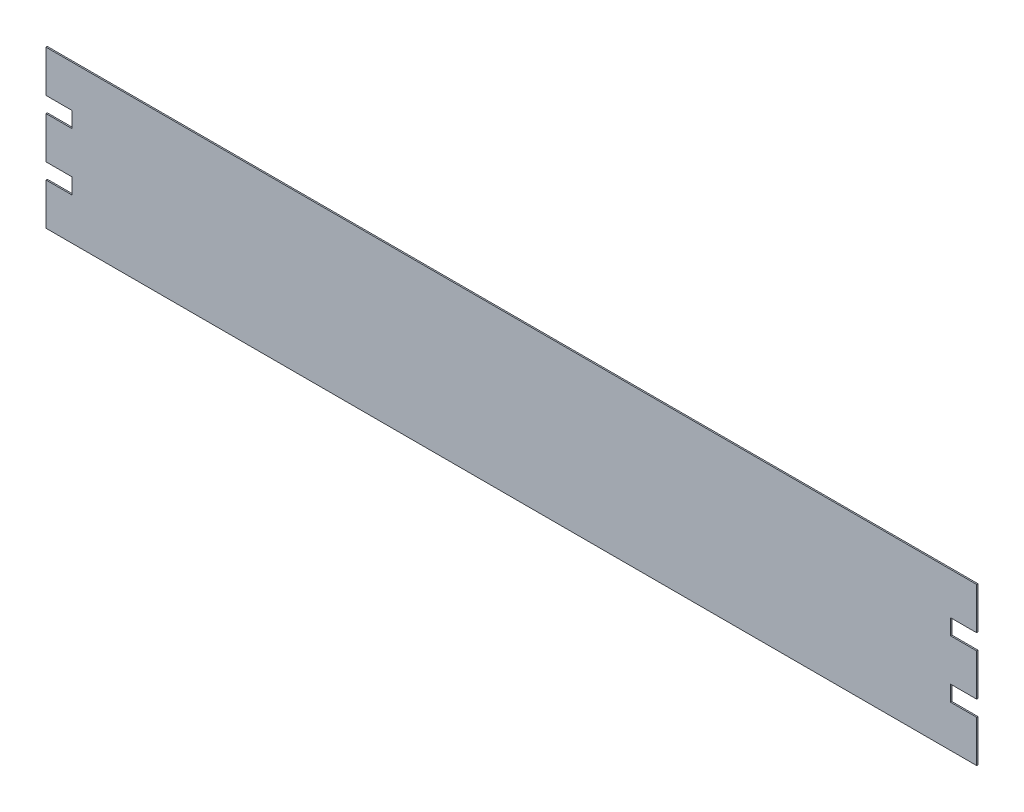
ISO-10303-21;
HEADER;
FILE_DESCRIPTION(('STEP AP214'),'2;1');
FILE_NAME('part.step','',(''),(''),'','','');
FILE_SCHEMA(('AUTOMOTIVE_DESIGN { 1 0 10303 214 1 1 1 1 }'));
ENDSEC;
DATA;
#1=APPLICATION_CONTEXT('core data for automotive mechanical design processes');
#2=APPLICATION_PROTOCOL_DEFINITION('international standard','automotive_design',2000,#1);
#3=PRODUCT_CONTEXT('',#1,'mechanical');
#4=PRODUCT('Part','Part','',(#3));
#5=PRODUCT_RELATED_PRODUCT_CATEGORY('part','',(#4));
#6=PRODUCT_DEFINITION_FORMATION('','',#4);
#7=PRODUCT_DEFINITION_CONTEXT('part definition',#1,'design');
#8=PRODUCT_DEFINITION('design','',#6,#7);
#9=PRODUCT_DEFINITION_SHAPE('','',#8);
#10=(LENGTH_UNIT() NAMED_UNIT(*) SI_UNIT(.MILLI.,.METRE.));
#11=(NAMED_UNIT(*) PLANE_ANGLE_UNIT() SI_UNIT($,.RADIAN.));
#12=(NAMED_UNIT(*) SI_UNIT($,.STERADIAN.) SOLID_ANGLE_UNIT());
#13=UNCERTAINTY_MEASURE_WITH_UNIT(LENGTH_MEASURE(1.E-05),#10,'distance_accuracy_value','');
#14=(GEOMETRIC_REPRESENTATION_CONTEXT(3) GLOBAL_UNCERTAINTY_ASSIGNED_CONTEXT((#13)) GLOBAL_UNIT_ASSIGNED_CONTEXT((#10,
#11,#12)) REPRESENTATION_CONTEXT('',''));
#15=CARTESIAN_POINT('',(0.,0.,0.));
#16=DIRECTION('',(0.,0.,1.));
#17=DIRECTION('',(1.,0.,0.));
#18=AXIS2_PLACEMENT_3D('',#15,#16,#17);
#19=CARTESIAN_POINT('',(0.,50.,0.125));
#20=DIRECTION('',(1.,0.,0.));
#21=DIRECTION('',(0.,1.,0.));
#22=AXIS2_PLACEMENT_3D('',#19,#20,#21);
#23=PLANE('',#22);
#24=DIRECTION('',(0.,-1.,0.));
#25=VECTOR('',#24,1.);
#26=CARTESIAN_POINT('',(0.,50.,-0.125));
#27=LINE('',#26,#25);
#28=CARTESIAN_POINT('',(0.,28.,-0.125));
#29=VERTEX_POINT('',#28);
#30=CARTESIAN_POINT('',(0.,20.,-0.125));
#31=VERTEX_POINT('',#30);
#32=EDGE_CURVE('E185',#29,#31,#27,.T.);
#33=ORIENTED_EDGE('',*,*,#32,.T.);
#34=DIRECTION('',(0.,0.,1.));
#35=VECTOR('',#34,1.);
#36=CARTESIAN_POINT('',(0.,20.,-0.125));
#37=LINE('',#36,#35);
#38=CARTESIAN_POINT('',(0.,20.,0.125));
#39=VERTEX_POINT('',#38);
#40=EDGE_CURVE('E172',#31,#39,#37,.T.);
#41=ORIENTED_EDGE('',*,*,#40,.T.);
#42=DIRECTION('',(0.,-1.,0.));
#43=VECTOR('',#42,1.);
#44=CARTESIAN_POINT('',(0.,50.,0.125));
#45=LINE('',#44,#43);
#46=CARTESIAN_POINT('',(0.,28.,0.125));
#47=VERTEX_POINT('',#46);
#48=EDGE_CURVE('E184',#47,#39,#45,.T.);
#49=ORIENTED_EDGE('',*,*,#48,.F.);
#50=DIRECTION('',(0.,0.,1.));
#51=VECTOR('',#50,1.);
#52=CARTESIAN_POINT('',(0.,28.,-0.125));
#53=LINE('',#52,#51);
#54=EDGE_CURVE('E317',#29,#47,#53,.T.);
#55=ORIENTED_EDGE('',*,*,#54,.F.);
#56=EDGE_LOOP('',(#33,#41,#49,#55));
#57=FACE_BOUND('',#56,.T.);
#58=ADVANCED_FACE('F32',(#57),#23,.F.);
#59=CARTESIAN_POINT('',(178.,20.,0.125));
#60=DIRECTION('',(-1.,0.,0.));
#61=DIRECTION('',(0.,0.,1.));
#62=AXIS2_PLACEMENT_3D('',#59,#60,#61);
#63=PLANE('',#62);
#64=DIRECTION('',(0.,1.,0.));
#65=VECTOR('',#64,1.);
#66=CARTESIAN_POINT('',(178.,20.,-0.125));
#67=LINE('',#66,#65);
#68=CARTESIAN_POINT('',(178.,20.,-0.125));
#69=VERTEX_POINT('',#68);
#70=CARTESIAN_POINT('',(178.,28.,-0.125));
#71=VERTEX_POINT('',#70);
#72=EDGE_CURVE('E197',#69,#71,#67,.T.);
#73=ORIENTED_EDGE('',*,*,#72,.T.);
#74=DIRECTION('',(0.,0.,1.));
#75=VECTOR('',#74,1.);
#76=CARTESIAN_POINT('',(178.,28.,-0.125));
#77=LINE('',#76,#75);
#78=CARTESIAN_POINT('',(178.,28.,0.125));
#79=VERTEX_POINT('',#78);
#80=EDGE_CURVE('E297',#71,#79,#77,.T.);
#81=ORIENTED_EDGE('',*,*,#80,.T.);
#82=DIRECTION('',(0.,1.,0.));
#83=VECTOR('',#82,1.);
#84=CARTESIAN_POINT('',(178.,20.,0.125));
#85=LINE('',#84,#83);
#86=CARTESIAN_POINT('',(178.,20.,0.125));
#87=VERTEX_POINT('',#86);
#88=EDGE_CURVE('E268',#87,#79,#85,.T.);
#89=ORIENTED_EDGE('',*,*,#88,.F.);
#90=DIRECTION('',(0.,0.,-1.));
#91=VECTOR('',#90,1.);
#92=CARTESIAN_POINT('',(178.,20.,0.125));
#93=LINE('',#92,#91);
#94=EDGE_CURVE('E11',#87,#69,#93,.T.);
#95=ORIENTED_EDGE('',*,*,#94,.T.);
#96=EDGE_LOOP('',(#73,#81,#89,#95));
#97=FACE_BOUND('',#96,.T.);
#98=ADVANCED_FACE('F371',(#97),#63,.F.);
#99=CARTESIAN_POINT('',(0.,39.,-0.125));
#100=VERTEX_POINT('',#99);
#101=CARTESIAN_POINT('',(0.,31.,-0.125));
#102=VERTEX_POINT('',#101);
#103=EDGE_CURVE('E274',#100,#102,#27,.T.);
#104=ORIENTED_EDGE('',*,*,#103,.T.);
#105=DIRECTION('',(0.,0.,1.));
#106=VECTOR('',#105,1.);
#107=CARTESIAN_POINT('',(0.,31.,-0.125));
#108=LINE('',#107,#106);
#109=CARTESIAN_POINT('',(0.,31.,0.125));
#110=VERTEX_POINT('',#109);
#111=EDGE_CURVE('E313',#102,#110,#108,.T.);
#112=ORIENTED_EDGE('',*,*,#111,.T.);
#113=CARTESIAN_POINT('',(0.,39.,0.125));
#114=VERTEX_POINT('',#113);
#115=EDGE_CURVE('E193',#114,#110,#45,.T.);
#116=ORIENTED_EDGE('',*,*,#115,.F.);
#117=DIRECTION('',(0.,0.,1.));
#118=VECTOR('',#117,1.);
#119=CARTESIAN_POINT('',(0.,39.,-0.125));
#120=LINE('',#119,#118);
#121=EDGE_CURVE('E219',#100,#114,#120,.T.);
#122=ORIENTED_EDGE('',*,*,#121,.F.);
#123=EDGE_LOOP('',(#104,#112,#116,#122));
#124=FACE_BOUND('',#123,.T.);
#125=ADVANCED_FACE('F311',(#124),#23,.F.);
#126=CARTESIAN_POINT('',(178.,31.,0.125));
#127=VERTEX_POINT('',#126);
#128=CARTESIAN_POINT('',(178.,39.,0.125));
#129=VERTEX_POINT('',#128);
#130=EDGE_CURVE('E266',#127,#129,#85,.T.);
#131=ORIENTED_EDGE('',*,*,#130,.F.);
#132=DIRECTION('',(0.,0.,1.));
#133=VECTOR('',#132,1.);
#134=CARTESIAN_POINT('',(178.,31.,-0.125));
#135=LINE('',#134,#133);
#136=CARTESIAN_POINT('',(178.,31.,-0.125));
#137=VERTEX_POINT('',#136);
#138=EDGE_CURVE('E334',#137,#127,#135,.T.);
#139=ORIENTED_EDGE('',*,*,#138,.F.);
#140=CARTESIAN_POINT('',(178.,39.,-0.125));
#141=VERTEX_POINT('',#140);
#142=EDGE_CURVE('E278',#137,#141,#67,.T.);
#143=ORIENTED_EDGE('',*,*,#142,.T.);
#144=DIRECTION('',(0.,0.,1.));
#145=VECTOR('',#144,1.);
#146=CARTESIAN_POINT('',(178.,39.,-0.125));
#147=LINE('',#146,#145);
#148=EDGE_CURVE('E247',#141,#129,#147,.T.);
#149=ORIENTED_EDGE('',*,*,#148,.T.);
#150=EDGE_LOOP('',(#131,#139,#143,#149));
#151=FACE_BOUND('',#150,.T.);
#152=ADVANCED_FACE('F355',(#151),#63,.F.);
#153=CARTESIAN_POINT('',(0.,50.,-0.125));
#154=VERTEX_POINT('',#153);
#155=CARTESIAN_POINT('',(0.,42.,-0.125));
#156=VERTEX_POINT('',#155);
#157=EDGE_CURVE('E215',#154,#156,#27,.T.);
#158=ORIENTED_EDGE('',*,*,#157,.T.);
#159=DIRECTION('',(0.,0.,1.));
#160=VECTOR('',#159,1.);
#161=CARTESIAN_POINT('',(0.,42.,-0.125));
#162=LINE('',#161,#160);
#163=CARTESIAN_POINT('',(0.,42.,0.125));
#164=VERTEX_POINT('',#163);
#165=EDGE_CURVE('E214',#156,#164,#162,.T.);
#166=ORIENTED_EDGE('',*,*,#165,.T.);
#167=CARTESIAN_POINT('',(0.,50.,0.125));
#168=VERTEX_POINT('',#167);
#169=EDGE_CURVE('E179',#168,#164,#45,.T.);
#170=ORIENTED_EDGE('',*,*,#169,.F.);
#171=DIRECTION('',(0.,0.,-1.));
#172=VECTOR('',#171,1.);
#173=CARTESIAN_POINT('',(0.,50.,0.125));
#174=LINE('',#173,#172);
#175=EDGE_CURVE('E212',#168,#154,#174,.T.);
#176=ORIENTED_EDGE('',*,*,#175,.T.);
#177=EDGE_LOOP('',(#158,#166,#170,#176));
#178=FACE_BOUND('',#177,.T.);
#179=ADVANCED_FACE('F34',(#178),#23,.F.);
#180=CARTESIAN_POINT('',(173.,20.,0.125));
#181=DIRECTION('',(0.,1.,0.));
#182=DIRECTION('',(0.,0.,1.));
#183=AXIS2_PLACEMENT_3D('',#180,#181,#182);
#184=PLANE('',#183);
#185=DIRECTION('',(1.,0.,0.));
#186=VECTOR('',#185,1.);
#187=CARTESIAN_POINT('',(173.,20.,-0.125));
#188=LINE('',#187,#186);
#189=EDGE_CURVE('E55',#31,#69,#188,.T.);
#190=ORIENTED_EDGE('',*,*,#189,.T.);
#191=ORIENTED_EDGE('',*,*,#94,.F.);
#192=DIRECTION('',(1.,0.,0.));
#193=VECTOR('',#192,1.);
#194=CARTESIAN_POINT('',(173.,20.,0.125));
#195=LINE('',#194,#193);
#196=EDGE_CURVE('E169',#39,#87,#195,.T.);
#197=ORIENTED_EDGE('',*,*,#196,.F.);
#198=ORIENTED_EDGE('',*,*,#40,.F.);
#199=EDGE_LOOP('',(#190,#191,#197,#198));
#200=FACE_BOUND('',#199,.T.);
#201=ADVANCED_FACE('F171',(#200),#184,.F.);
#202=CARTESIAN_POINT('',(178.,42.,0.125));
#203=VERTEX_POINT('',#202);
#204=CARTESIAN_POINT('',(178.,50.,0.125));
#205=VERTEX_POINT('',#204);
#206=EDGE_CURVE('E178',#203,#205,#85,.T.);
#207=ORIENTED_EDGE('',*,*,#206,.F.);
#208=DIRECTION('',(0.,0.,1.));
#209=VECTOR('',#208,1.);
#210=CARTESIAN_POINT('',(178.,42.,-0.125));
#211=LINE('',#210,#209);
#212=CARTESIAN_POINT('',(178.,42.,-0.125));
#213=VERTEX_POINT('',#212);
#214=EDGE_CURVE('E238',#213,#203,#211,.T.);
#215=ORIENTED_EDGE('',*,*,#214,.F.);
#216=CARTESIAN_POINT('',(178.,50.,-0.125));
#217=VERTEX_POINT('',#216);
#218=EDGE_CURVE('E276',#213,#217,#67,.T.);
#219=ORIENTED_EDGE('',*,*,#218,.T.);
#220=DIRECTION('',(0.,0.,-1.));
#221=VECTOR('',#220,1.);
#222=CARTESIAN_POINT('',(178.,50.,0.125));
#223=LINE('',#222,#221);
#224=EDGE_CURVE('E40',#205,#217,#223,.T.);
#225=ORIENTED_EDGE('',*,*,#224,.F.);
#226=EDGE_LOOP('',(#207,#215,#219,#225));
#227=FACE_BOUND('',#226,.T.);
#228=ADVANCED_FACE('F264',(#227),#63,.F.);
#229=CARTESIAN_POINT('',(178.,50.,0.125));
#230=DIRECTION('',(0.,-1.,0.));
#231=DIRECTION('',(1.,0.,0.));
#232=AXIS2_PLACEMENT_3D('',#229,#230,#231);
#233=PLANE('',#232);
#234=DIRECTION('',(-1.,0.,0.));
#235=VECTOR('',#234,1.);
#236=CARTESIAN_POINT('',(178.,50.,-0.125));
#237=LINE('',#236,#235);
#238=EDGE_CURVE('E194',#217,#154,#237,.T.);
#239=ORIENTED_EDGE('',*,*,#238,.T.);
#240=ORIENTED_EDGE('',*,*,#175,.F.);
#241=DIRECTION('',(-1.,0.,0.));
#242=VECTOR('',#241,1.);
#243=CARTESIAN_POINT('',(178.,50.,0.125));
#244=LINE('',#243,#242);
#245=EDGE_CURVE('E206',#205,#168,#244,.T.);
#246=ORIENTED_EDGE('',*,*,#245,.F.);
#247=ORIENTED_EDGE('',*,*,#224,.T.);
#248=EDGE_LOOP('',(#239,#240,#246,#247));
#249=FACE_BOUND('',#248,.T.);
#250=ADVANCED_FACE('F281',(#249),#233,.F.);
#251=CARTESIAN_POINT('',(0.,0.,0.125));
#252=DIRECTION('',(0.,0.,1.));
#253=DIRECTION('',(1.,0.,0.));
#254=AXIS2_PLACEMENT_3D('',#251,#252,#253);
#255=PLANE('',#254);
#256=ORIENTED_EDGE('',*,*,#48,.T.);
#257=ORIENTED_EDGE('',*,*,#196,.T.);
#258=ORIENTED_EDGE('',*,*,#88,.T.);
#259=DIRECTION('',(1.,0.,0.));
#260=VECTOR('',#259,1.);
#261=CARTESIAN_POINT('',(178.,28.,0.125));
#262=LINE('',#261,#260);
#263=CARTESIAN_POINT('',(173.,28.,0.125));
#264=VERTEX_POINT('',#263);
#265=EDGE_CURVE('E329',#264,#79,#262,.T.);
#266=ORIENTED_EDGE('',*,*,#265,.F.);
#267=DIRECTION('',(0.,-1.,0.));
#268=VECTOR('',#267,1.);
#269=CARTESIAN_POINT('',(173.,31.,0.125));
#270=LINE('',#269,#268);
#271=CARTESIAN_POINT('',(173.,31.,0.125));
#272=VERTEX_POINT('',#271);
#273=EDGE_CURVE('E338',#272,#264,#270,.T.);
#274=ORIENTED_EDGE('',*,*,#273,.F.);
#275=DIRECTION('',(-1.,0.,0.));
#276=VECTOR('',#275,1.);
#277=CARTESIAN_POINT('',(178.,31.,0.125));
#278=LINE('',#277,#276);
#279=EDGE_CURVE('E335',#127,#272,#278,.T.);
#280=ORIENTED_EDGE('',*,*,#279,.F.);
#281=ORIENTED_EDGE('',*,*,#130,.T.);
#282=DIRECTION('',(1.,0.,0.));
#283=VECTOR('',#282,1.);
#284=CARTESIAN_POINT('',(178.,39.,0.125));
#285=LINE('',#284,#283);
#286=CARTESIAN_POINT('',(173.,39.,0.125));
#287=VERTEX_POINT('',#286);
#288=EDGE_CURVE('E232',#287,#129,#285,.T.);
#289=ORIENTED_EDGE('',*,*,#288,.F.);
#290=DIRECTION('',(0.,-1.,0.));
#291=VECTOR('',#290,1.);
#292=CARTESIAN_POINT('',(173.,42.,0.125));
#293=LINE('',#292,#291);
#294=CARTESIAN_POINT('',(173.,42.,0.125));
#295=VERTEX_POINT('',#294);
#296=EDGE_CURVE('E242',#295,#287,#293,.T.);
#297=ORIENTED_EDGE('',*,*,#296,.F.);
#298=DIRECTION('',(-1.,0.,0.));
#299=VECTOR('',#298,1.);
#300=CARTESIAN_POINT('',(178.,42.,0.125));
#301=LINE('',#300,#299);
#302=EDGE_CURVE('E239',#203,#295,#301,.T.);
#303=ORIENTED_EDGE('',*,*,#302,.F.);
#304=ORIENTED_EDGE('',*,*,#206,.T.);
#305=ORIENTED_EDGE('',*,*,#245,.T.);
#306=ORIENTED_EDGE('',*,*,#169,.T.);
#307=DIRECTION('',(-1.,0.,0.));
#308=VECTOR('',#307,1.);
#309=CARTESIAN_POINT('',(5.00000000000003,42.,0.125));
#310=LINE('',#309,#308);
#311=CARTESIAN_POINT('',(5.00000000000003,42.,0.125));
#312=VERTEX_POINT('',#311);
#313=EDGE_CURVE('E204',#312,#164,#310,.T.);
#314=ORIENTED_EDGE('',*,*,#313,.F.);
#315=DIRECTION('',(0.,1.,0.));
#316=VECTOR('',#315,1.);
#317=CARTESIAN_POINT('',(5.00000000000003,42.,0.125));
#318=LINE('',#317,#316);
#319=CARTESIAN_POINT('',(5.00000000000003,39.,0.125));
#320=VERTEX_POINT('',#319);
#321=EDGE_CURVE('E294',#320,#312,#318,.T.);
#322=ORIENTED_EDGE('',*,*,#321,.F.);
#323=DIRECTION('',(1.,0.,0.));
#324=VECTOR('',#323,1.);
#325=CARTESIAN_POINT('',(5.00000000000003,39.,0.125));
#326=LINE('',#325,#324);
#327=EDGE_CURVE('E290',#114,#320,#326,.T.);
#328=ORIENTED_EDGE('',*,*,#327,.F.);
#329=ORIENTED_EDGE('',*,*,#115,.T.);
#330=DIRECTION('',(-1.,0.,0.));
#331=VECTOR('',#330,1.);
#332=CARTESIAN_POINT('',(5.00000000000003,31.,0.125));
#333=LINE('',#332,#331);
#334=CARTESIAN_POINT('',(5.00000000000003,31.,0.125));
#335=VERTEX_POINT('',#334);
#336=EDGE_CURVE('E550',#335,#110,#333,.T.);
#337=ORIENTED_EDGE('',*,*,#336,.F.);
#338=DIRECTION('',(0.,1.,0.));
#339=VECTOR('',#338,1.);
#340=CARTESIAN_POINT('',(5.00000000000003,31.,0.125));
#341=LINE('',#340,#339);
#342=CARTESIAN_POINT('',(5.00000000000003,28.,0.125));
#343=VERTEX_POINT('',#342);
#344=EDGE_CURVE('E186',#343,#335,#341,.T.);
#345=ORIENTED_EDGE('',*,*,#344,.F.);
#346=DIRECTION('',(1.,0.,0.));
#347=VECTOR('',#346,1.);
#348=CARTESIAN_POINT('',(5.00000000000003,28.,0.125));
#349=LINE('',#348,#347);
#350=EDGE_CURVE('E192',#47,#343,#349,.T.);
#351=ORIENTED_EDGE('',*,*,#350,.F.);
#352=EDGE_LOOP('',(#256,#257,#258,#266,#274,#280,#281,#289,#297,#303,#304,#305,#306,#314,#322,
#328,#329,#337,#345,#351));
#353=FACE_BOUND('',#352,.T.);
#354=ADVANCED_FACE('F189',(#353),#255,.T.);
#355=CARTESIAN_POINT('',(0.,0.,-0.125));
#356=DIRECTION('',(0.,0.,1.));
#357=DIRECTION('',(1.,0.,0.));
#358=AXIS2_PLACEMENT_3D('',#355,#356,#357);
#359=PLANE('',#358);
#360=ORIENTED_EDGE('',*,*,#189,.F.);
#361=ORIENTED_EDGE('',*,*,#32,.F.);
#362=DIRECTION('',(1.,0.,0.));
#363=VECTOR('',#362,1.);
#364=CARTESIAN_POINT('',(5.00000000000003,28.,-0.125));
#365=LINE('',#364,#363);
#366=CARTESIAN_POINT('',(5.00000000000003,28.,-0.125));
#367=VERTEX_POINT('',#366);
#368=EDGE_CURVE('E322',#29,#367,#365,.T.);
#369=ORIENTED_EDGE('',*,*,#368,.T.);
#370=DIRECTION('',(0.,1.,0.));
#371=VECTOR('',#370,1.);
#372=CARTESIAN_POINT('',(5.00000000000003,31.,-0.125));
#373=LINE('',#372,#371);
#374=CARTESIAN_POINT('',(5.00000000000003,31.,-0.125));
#375=VERTEX_POINT('',#374);
#376=EDGE_CURVE('E553',#367,#375,#373,.T.);
#377=ORIENTED_EDGE('',*,*,#376,.T.);
#378=DIRECTION('',(-1.,0.,0.));
#379=VECTOR('',#378,1.);
#380=CARTESIAN_POINT('',(5.00000000000003,31.,-0.125));
#381=LINE('',#380,#379);
#382=EDGE_CURVE('E560',#375,#102,#381,.T.);
#383=ORIENTED_EDGE('',*,*,#382,.T.);
#384=ORIENTED_EDGE('',*,*,#103,.F.);
#385=DIRECTION('',(1.,0.,0.));
#386=VECTOR('',#385,1.);
#387=CARTESIAN_POINT('',(5.00000000000003,39.,-0.125));
#388=LINE('',#387,#386);
#389=CARTESIAN_POINT('',(5.00000000000003,39.,-0.125));
#390=VERTEX_POINT('',#389);
#391=EDGE_CURVE('E224',#100,#390,#388,.T.);
#392=ORIENTED_EDGE('',*,*,#391,.T.);
#393=DIRECTION('',(0.,1.,0.));
#394=VECTOR('',#393,1.);
#395=CARTESIAN_POINT('',(5.00000000000003,42.,-0.125));
#396=LINE('',#395,#394);
#397=CARTESIAN_POINT('',(5.00000000000003,42.,-0.125));
#398=VERTEX_POINT('',#397);
#399=EDGE_CURVE('E287',#390,#398,#396,.T.);
#400=ORIENTED_EDGE('',*,*,#399,.T.);
#401=DIRECTION('',(-1.,0.,0.));
#402=VECTOR('',#401,1.);
#403=CARTESIAN_POINT('',(5.00000000000003,42.,-0.125));
#404=LINE('',#403,#402);
#405=EDGE_CURVE('E284',#398,#156,#404,.T.);
#406=ORIENTED_EDGE('',*,*,#405,.T.);
#407=ORIENTED_EDGE('',*,*,#157,.F.);
#408=ORIENTED_EDGE('',*,*,#238,.F.);
#409=ORIENTED_EDGE('',*,*,#218,.F.);
#410=DIRECTION('',(-1.,0.,0.));
#411=VECTOR('',#410,1.);
#412=CARTESIAN_POINT('',(178.,42.,-0.125));
#413=LINE('',#412,#411);
#414=CARTESIAN_POINT('',(173.,42.,-0.125));
#415=VERTEX_POINT('',#414);
#416=EDGE_CURVE('E228',#213,#415,#413,.T.);
#417=ORIENTED_EDGE('',*,*,#416,.T.);
#418=DIRECTION('',(0.,-1.,0.));
#419=VECTOR('',#418,1.);
#420=CARTESIAN_POINT('',(173.,42.,-0.125));
#421=LINE('',#420,#419);
#422=CARTESIAN_POINT('',(173.,39.,-0.125));
#423=VERTEX_POINT('',#422);
#424=EDGE_CURVE('E231',#415,#423,#421,.T.);
#425=ORIENTED_EDGE('',*,*,#424,.T.);
#426=DIRECTION('',(1.,0.,0.));
#427=VECTOR('',#426,1.);
#428=CARTESIAN_POINT('',(178.,39.,-0.125));
#429=LINE('',#428,#427);
#430=EDGE_CURVE('E235',#423,#141,#429,.T.);
#431=ORIENTED_EDGE('',*,*,#430,.T.);
#432=ORIENTED_EDGE('',*,*,#142,.F.);
#433=DIRECTION('',(-1.,0.,0.));
#434=VECTOR('',#433,1.);
#435=CARTESIAN_POINT('',(178.,31.,-0.125));
#436=LINE('',#435,#434);
#437=CARTESIAN_POINT('',(173.,31.,-0.125));
#438=VERTEX_POINT('',#437);
#439=EDGE_CURVE('E326',#137,#438,#436,.T.);
#440=ORIENTED_EDGE('',*,*,#439,.T.);
#441=DIRECTION('',(0.,-1.,0.));
#442=VECTOR('',#441,1.);
#443=CARTESIAN_POINT('',(173.,31.,-0.125));
#444=LINE('',#443,#442);
#445=CARTESIAN_POINT('',(173.,28.,-0.125));
#446=VERTEX_POINT('',#445);
#447=EDGE_CURVE('E47',#438,#446,#444,.T.);
#448=ORIENTED_EDGE('',*,*,#447,.T.);
#449=DIRECTION('',(1.,0.,0.));
#450=VECTOR('',#449,1.);
#451=CARTESIAN_POINT('',(178.,28.,-0.125));
#452=LINE('',#451,#450);
#453=EDGE_CURVE('E331',#446,#71,#452,.T.);
#454=ORIENTED_EDGE('',*,*,#453,.T.);
#455=ORIENTED_EDGE('',*,*,#72,.F.);
#456=EDGE_LOOP('',(#360,#361,#369,#377,#383,#384,#392,#400,#406,#407,#408,#409,#417,#425,#431,
#432,#440,#448,#454,#455));
#457=FACE_BOUND('',#456,.T.);
#458=ADVANCED_FACE('F282',(#457),#359,.F.);
#459=CARTESIAN_POINT('',(178.,39.,-0.125));
#460=DIRECTION('',(0.,-1.,0.));
#461=DIRECTION('',(0.,0.,-1.));
#462=AXIS2_PLACEMENT_3D('',#459,#460,#461);
#463=PLANE('',#462);
#464=ORIENTED_EDGE('',*,*,#288,.T.);
#465=ORIENTED_EDGE('',*,*,#148,.F.);
#466=ORIENTED_EDGE('',*,*,#430,.F.);
#467=DIRECTION('',(0.,0.,1.));
#468=VECTOR('',#467,1.);
#469=CARTESIAN_POINT('',(173.,39.,-0.125));
#470=LINE('',#469,#468);
#471=EDGE_CURVE('E250',#423,#287,#470,.T.);
#472=ORIENTED_EDGE('',*,*,#471,.T.);
#473=EDGE_LOOP('',(#464,#465,#466,#472));
#474=FACE_BOUND('',#473,.T.);
#475=ADVANCED_FACE('F359',(#474),#463,.F.);
#476=CARTESIAN_POINT('',(173.,42.,-0.125));
#477=DIRECTION('',(-1.,0.,0.));
#478=DIRECTION('',(0.,0.,1.));
#479=AXIS2_PLACEMENT_3D('',#476,#477,#478);
#480=PLANE('',#479);
#481=ORIENTED_EDGE('',*,*,#296,.T.);
#482=ORIENTED_EDGE('',*,*,#471,.F.);
#483=ORIENTED_EDGE('',*,*,#424,.F.);
#484=DIRECTION('',(0.,0.,1.));
#485=VECTOR('',#484,1.);
#486=CARTESIAN_POINT('',(173.,42.,-0.125));
#487=LINE('',#486,#485);
#488=EDGE_CURVE('E252',#415,#295,#487,.T.);
#489=ORIENTED_EDGE('',*,*,#488,.T.);
#490=EDGE_LOOP('',(#481,#482,#483,#489));
#491=FACE_BOUND('',#490,.T.);
#492=ADVANCED_FACE('F361',(#491),#480,.F.);
#493=CARTESIAN_POINT('',(178.,42.,-0.125));
#494=DIRECTION('',(0.,1.,0.));
#495=DIRECTION('',(0.,0.,1.));
#496=AXIS2_PLACEMENT_3D('',#493,#494,#495);
#497=PLANE('',#496);
#498=ORIENTED_EDGE('',*,*,#302,.T.);
#499=ORIENTED_EDGE('',*,*,#488,.F.);
#500=ORIENTED_EDGE('',*,*,#416,.F.);
#501=ORIENTED_EDGE('',*,*,#214,.T.);
#502=EDGE_LOOP('',(#498,#499,#500,#501));
#503=FACE_BOUND('',#502,.T.);
#504=ADVANCED_FACE('F256',(#503),#497,.F.);
#505=CARTESIAN_POINT('',(5.00000000000003,42.,-0.125));
#506=DIRECTION('',(1.,0.,0.));
#507=DIRECTION('',(0.,0.,-1.));
#508=AXIS2_PLACEMENT_3D('',#505,#506,#507);
#509=PLANE('',#508);
#510=ORIENTED_EDGE('',*,*,#321,.T.);
#511=DIRECTION('',(0.,0.,1.));
#512=VECTOR('',#511,1.);
#513=CARTESIAN_POINT('',(5.00000000000003,42.,-0.125));
#514=LINE('',#513,#512);
#515=EDGE_CURVE('E220',#398,#312,#514,.T.);
#516=ORIENTED_EDGE('',*,*,#515,.F.);
#517=ORIENTED_EDGE('',*,*,#399,.F.);
#518=DIRECTION('',(0.,0.,1.));
#519=VECTOR('',#518,1.);
#520=CARTESIAN_POINT('',(5.00000000000003,39.,-0.125));
#521=LINE('',#520,#519);
#522=EDGE_CURVE('E222',#390,#320,#521,.T.);
#523=ORIENTED_EDGE('',*,*,#522,.T.);
#524=EDGE_LOOP('',(#510,#516,#517,#523));
#525=FACE_BOUND('',#524,.T.);
#526=ADVANCED_FACE('F301',(#525),#509,.F.);
#527=CARTESIAN_POINT('',(5.00000000000003,39.,-0.125));
#528=DIRECTION('',(0.,-1.,0.));
#529=DIRECTION('',(0.,0.,-1.));
#530=AXIS2_PLACEMENT_3D('',#527,#528,#529);
#531=PLANE('',#530);
#532=ORIENTED_EDGE('',*,*,#327,.T.);
#533=ORIENTED_EDGE('',*,*,#522,.F.);
#534=ORIENTED_EDGE('',*,*,#391,.F.);
#535=ORIENTED_EDGE('',*,*,#121,.T.);
#536=EDGE_LOOP('',(#532,#533,#534,#535));
#537=FACE_BOUND('',#536,.T.);
#538=ADVANCED_FACE('F304',(#537),#531,.F.);
#539=CARTESIAN_POINT('',(5.00000000000003,42.,-0.125));
#540=DIRECTION('',(0.,1.,0.));
#541=DIRECTION('',(0.,0.,1.));
#542=AXIS2_PLACEMENT_3D('',#539,#540,#541);
#543=PLANE('',#542);
#544=ORIENTED_EDGE('',*,*,#313,.T.);
#545=ORIENTED_EDGE('',*,*,#165,.F.);
#546=ORIENTED_EDGE('',*,*,#405,.F.);
#547=ORIENTED_EDGE('',*,*,#515,.T.);
#548=EDGE_LOOP('',(#544,#545,#546,#547));
#549=FACE_BOUND('',#548,.T.);
#550=ADVANCED_FACE('F458',(#549),#543,.F.);
#551=CARTESIAN_POINT('',(5.00000000000003,31.,-0.125));
#552=DIRECTION('',(1.,0.,0.));
#553=DIRECTION('',(0.,0.,-1.));
#554=AXIS2_PLACEMENT_3D('',#551,#552,#553);
#555=PLANE('',#554);
#556=ORIENTED_EDGE('',*,*,#344,.T.);
#557=DIRECTION('',(0.,0.,1.));
#558=VECTOR('',#557,1.);
#559=CARTESIAN_POINT('',(5.00000000000003,31.,-0.125));
#560=LINE('',#559,#558);
#561=EDGE_CURVE('E318',#375,#335,#560,.T.);
#562=ORIENTED_EDGE('',*,*,#561,.F.);
#563=ORIENTED_EDGE('',*,*,#376,.F.);
#564=DIRECTION('',(0.,0.,1.));
#565=VECTOR('',#564,1.);
#566=CARTESIAN_POINT('',(5.00000000000003,28.,-0.125));
#567=LINE('',#566,#565);
#568=EDGE_CURVE('E320',#367,#343,#567,.T.);
#569=ORIENTED_EDGE('',*,*,#568,.T.);
#570=EDGE_LOOP('',(#556,#562,#563,#569));
#571=FACE_BOUND('',#570,.T.);
#572=ADVANCED_FACE('F467',(#571),#555,.F.);
#573=CARTESIAN_POINT('',(5.00000000000003,28.,-0.125));
#574=DIRECTION('',(0.,-1.,0.));
#575=DIRECTION('',(0.,0.,-1.));
#576=AXIS2_PLACEMENT_3D('',#573,#574,#575);
#577=PLANE('',#576);
#578=ORIENTED_EDGE('',*,*,#350,.T.);
#579=ORIENTED_EDGE('',*,*,#568,.F.);
#580=ORIENTED_EDGE('',*,*,#368,.F.);
#581=ORIENTED_EDGE('',*,*,#54,.T.);
#582=EDGE_LOOP('',(#578,#579,#580,#581));
#583=FACE_BOUND('',#582,.T.);
#584=ADVANCED_FACE('F476',(#583),#577,.F.);
#585=CARTESIAN_POINT('',(5.00000000000003,31.,-0.125));
#586=DIRECTION('',(0.,1.,0.));
#587=DIRECTION('',(0.,0.,1.));
#588=AXIS2_PLACEMENT_3D('',#585,#586,#587);
#589=PLANE('',#588);
#590=ORIENTED_EDGE('',*,*,#336,.T.);
#591=ORIENTED_EDGE('',*,*,#111,.F.);
#592=ORIENTED_EDGE('',*,*,#382,.F.);
#593=ORIENTED_EDGE('',*,*,#561,.T.);
#594=EDGE_LOOP('',(#590,#591,#592,#593));
#595=FACE_BOUND('',#594,.T.);
#596=ADVANCED_FACE('F486',(#595),#589,.F.);
#597=CARTESIAN_POINT('',(178.,28.,-0.125));
#598=DIRECTION('',(0.,-1.,0.));
#599=DIRECTION('',(0.,0.,-1.));
#600=AXIS2_PLACEMENT_3D('',#597,#598,#599);
#601=PLANE('',#600);
#602=ORIENTED_EDGE('',*,*,#265,.T.);
#603=ORIENTED_EDGE('',*,*,#80,.F.);
#604=ORIENTED_EDGE('',*,*,#453,.F.);
#605=DIRECTION('',(0.,0.,1.));
#606=VECTOR('',#605,1.);
#607=CARTESIAN_POINT('',(173.,28.,-0.125));
#608=LINE('',#607,#606);
#609=EDGE_CURVE('E344',#446,#264,#608,.T.);
#610=ORIENTED_EDGE('',*,*,#609,.T.);
#611=EDGE_LOOP('',(#602,#603,#604,#610));
#612=FACE_BOUND('',#611,.T.);
#613=ADVANCED_FACE('F496',(#612),#601,.F.);
#614=CARTESIAN_POINT('',(173.,31.,-0.125));
#615=DIRECTION('',(-1.,0.,0.));
#616=DIRECTION('',(0.,0.,1.));
#617=AXIS2_PLACEMENT_3D('',#614,#615,#616);
#618=PLANE('',#617);
#619=ORIENTED_EDGE('',*,*,#273,.T.);
#620=ORIENTED_EDGE('',*,*,#609,.F.);
#621=ORIENTED_EDGE('',*,*,#447,.F.);
#622=DIRECTION('',(0.,0.,1.));
#623=VECTOR('',#622,1.);
#624=CARTESIAN_POINT('',(173.,31.,-0.125));
#625=LINE('',#624,#623);
#626=EDGE_CURVE('E346',#438,#272,#625,.T.);
#627=ORIENTED_EDGE('',*,*,#626,.T.);
#628=EDGE_LOOP('',(#619,#620,#621,#627));
#629=FACE_BOUND('',#628,.T.);
#630=ADVANCED_FACE('F505',(#629),#618,.F.);
#631=CARTESIAN_POINT('',(178.,31.,-0.125));
#632=DIRECTION('',(0.,1.,0.));
#633=DIRECTION('',(0.,0.,1.));
#634=AXIS2_PLACEMENT_3D('',#631,#632,#633);
#635=PLANE('',#634);
#636=ORIENTED_EDGE('',*,*,#279,.T.);
#637=ORIENTED_EDGE('',*,*,#626,.F.);
#638=ORIENTED_EDGE('',*,*,#439,.F.);
#639=ORIENTED_EDGE('',*,*,#138,.T.);
#640=EDGE_LOOP('',(#636,#637,#638,#639));
#641=FACE_BOUND('',#640,.T.);
#642=ADVANCED_FACE('F350',(#641),#635,.F.);
#643=CLOSED_SHELL('',(#58,#98,#125,#152,#179,#201,#228,#250,#354,#458,#475,#492,#504,#526,#538,
#550,#572,#584,#596,#613,#630,#642));
#644=MANIFOLD_SOLID_BREP('B2',#643);
#645=ADVANCED_BREP_SHAPE_REPRESENTATION('',(#18,#644),#14);
#646=SHAPE_DEFINITION_REPRESENTATION(#9,#645);
ENDSEC;
END-ISO-10303-21;
